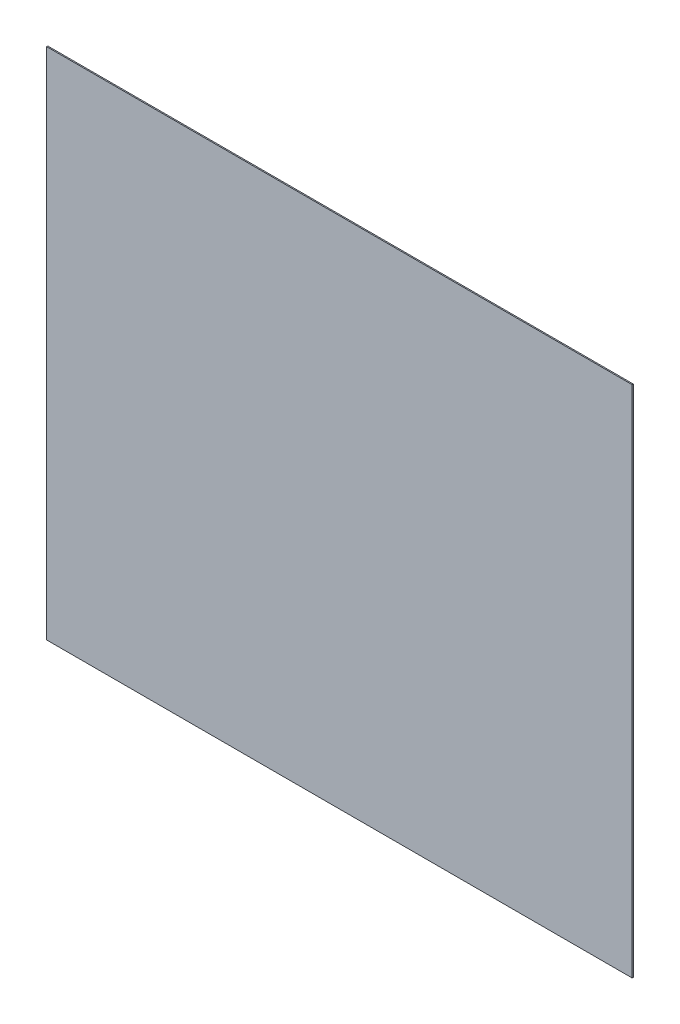
ISO-10303-21;
HEADER;
FILE_DESCRIPTION(('STEP AP214'),'2;1');
FILE_NAME('part.step','',(''),(''),'','','');
FILE_SCHEMA(('AUTOMOTIVE_DESIGN { 1 0 10303 214 1 1 1 1 }'));
ENDSEC;
DATA;
#1=APPLICATION_CONTEXT('core data for automotive mechanical design processes');
#2=APPLICATION_PROTOCOL_DEFINITION('international standard','automotive_design',2000,#1);
#3=PRODUCT_CONTEXT('',#1,'mechanical');
#4=PRODUCT('Part','Part','',(#3));
#5=PRODUCT_RELATED_PRODUCT_CATEGORY('part','',(#4));
#6=PRODUCT_DEFINITION_FORMATION('','',#4);
#7=PRODUCT_DEFINITION_CONTEXT('part definition',#1,'design');
#8=PRODUCT_DEFINITION('design','',#6,#7);
#9=PRODUCT_DEFINITION_SHAPE('','',#8);
#10=(LENGTH_UNIT() NAMED_UNIT(*) SI_UNIT(.MILLI.,.METRE.));
#11=(NAMED_UNIT(*) PLANE_ANGLE_UNIT() SI_UNIT($,.RADIAN.));
#12=(NAMED_UNIT(*) SI_UNIT($,.STERADIAN.) SOLID_ANGLE_UNIT());
#13=UNCERTAINTY_MEASURE_WITH_UNIT(LENGTH_MEASURE(1.E-05),#10,'distance_accuracy_value','');
#14=(GEOMETRIC_REPRESENTATION_CONTEXT(3) GLOBAL_UNCERTAINTY_ASSIGNED_CONTEXT((#13)) GLOBAL_UNIT_ASSIGNED_CONTEXT((#10,
#11,#12)) REPRESENTATION_CONTEXT('',''));
#15=CARTESIAN_POINT('',(0.,0.,0.));
#16=DIRECTION('',(0.,0.,1.));
#17=DIRECTION('',(1.,0.,0.));
#18=AXIS2_PLACEMENT_3D('',#15,#16,#17);
#19=CARTESIAN_POINT('',(0.,0.,2.9));
#20=DIRECTION('',(1.,0.,0.));
#21=DIRECTION('',(0.,1.,0.));
#22=AXIS2_PLACEMENT_3D('',#19,#20,#21);
#23=PLANE('',#22);
#24=DIRECTION('',(0.,-1.,0.));
#25=VECTOR('',#24,1.);
#26=CARTESIAN_POINT('',(0.,0.,0.));
#27=LINE('',#26,#25);
#28=CARTESIAN_POINT('',(0.,0.,0.));
#29=VERTEX_POINT('',#28);
#30=CARTESIAN_POINT('',(1.59204083889156E-13,-1300.,0.));
#31=VERTEX_POINT('',#30);
#32=EDGE_CURVE('E98',#29,#31,#27,.T.);
#33=ORIENTED_EDGE('',*,*,#32,.T.);
#34=DIRECTION('',(0.,0.,-1.));
#35=VECTOR('',#34,1.);
#36=CARTESIAN_POINT('',(1.59204083889156E-13,-1300.,2.9));
#37=LINE('',#36,#35);
#38=CARTESIAN_POINT('',(1.59204083889156E-13,-1300.,2.9));
#39=VERTEX_POINT('',#38);
#40=EDGE_CURVE('E11',#39,#31,#37,.T.);
#41=ORIENTED_EDGE('',*,*,#40,.F.);
#42=DIRECTION('',(0.,-1.,0.));
#43=VECTOR('',#42,1.);
#44=CARTESIAN_POINT('',(0.,0.,2.9));
#45=LINE('',#44,#43);
#46=CARTESIAN_POINT('',(0.,0.,2.9));
#47=VERTEX_POINT('',#46);
#48=EDGE_CURVE('E86',#47,#39,#45,.T.);
#49=ORIENTED_EDGE('',*,*,#48,.F.);
#50=DIRECTION('',(0.,0.,-1.));
#51=VECTOR('',#50,1.);
#52=CARTESIAN_POINT('',(0.,0.,2.9));
#53=LINE('',#52,#51);
#54=EDGE_CURVE('E94',#47,#29,#53,.T.);
#55=ORIENTED_EDGE('',*,*,#54,.T.);
#56=EDGE_LOOP('',(#33,#41,#49,#55));
#57=FACE_BOUND('',#56,.T.);
#58=ADVANCED_FACE('F35',(#57),#23,.F.);
#59=CARTESIAN_POINT('',(1.59204083889156E-13,-1300.,2.9));
#60=DIRECTION('',(0.,1.,0.));
#61=DIRECTION('',(0.,0.,1.));
#62=AXIS2_PLACEMENT_3D('',#59,#60,#61);
#63=PLANE('',#62);
#64=DIRECTION('',(1.,0.,0.));
#65=VECTOR('',#64,1.);
#66=CARTESIAN_POINT('',(1.59204083889156E-13,-1300.,0.));
#67=LINE('',#66,#65);
#68=CARTESIAN_POINT('',(1481.2,-1300.,0.));
#69=VERTEX_POINT('',#68);
#70=EDGE_CURVE('E90',#31,#69,#67,.T.);
#71=ORIENTED_EDGE('',*,*,#70,.T.);
#72=DIRECTION('',(0.,0.,-1.));
#73=VECTOR('',#72,1.);
#74=CARTESIAN_POINT('',(1481.2,-1300.,2.9));
#75=LINE('',#74,#73);
#76=CARTESIAN_POINT('',(1481.2,-1300.,2.9));
#77=VERTEX_POINT('',#76);
#78=EDGE_CURVE('E43',#77,#69,#75,.T.);
#79=ORIENTED_EDGE('',*,*,#78,.F.);
#80=DIRECTION('',(1.,0.,0.));
#81=VECTOR('',#80,1.);
#82=CARTESIAN_POINT('',(1.59204083889156E-13,-1300.,2.9));
#83=LINE('',#82,#81);
#84=EDGE_CURVE('E81',#39,#77,#83,.T.);
#85=ORIENTED_EDGE('',*,*,#84,.F.);
#86=ORIENTED_EDGE('',*,*,#40,.T.);
#87=EDGE_LOOP('',(#71,#79,#85,#86));
#88=FACE_BOUND('',#87,.T.);
#89=ADVANCED_FACE('F89',(#88),#63,.F.);
#90=CARTESIAN_POINT('',(1481.2,0.,2.9));
#91=DIRECTION('',(-1.,0.,0.));
#92=DIRECTION('',(0.,-1.,0.));
#93=AXIS2_PLACEMENT_3D('',#90,#91,#92);
#94=PLANE('',#93);
#95=DIRECTION('',(0.,1.,0.));
#96=VECTOR('',#95,1.);
#97=CARTESIAN_POINT('',(1481.2,0.,0.));
#98=LINE('',#97,#96);
#99=CARTESIAN_POINT('',(1481.2,0.,0.));
#100=VERTEX_POINT('',#99);
#101=EDGE_CURVE('E68',#69,#100,#98,.T.);
#102=ORIENTED_EDGE('',*,*,#101,.T.);
#103=DIRECTION('',(0.,0.,-1.));
#104=VECTOR('',#103,1.);
#105=CARTESIAN_POINT('',(1481.2,0.,2.9));
#106=LINE('',#105,#104);
#107=CARTESIAN_POINT('',(1481.2,0.,2.9));
#108=VERTEX_POINT('',#107);
#109=EDGE_CURVE('E91',#108,#100,#106,.T.);
#110=ORIENTED_EDGE('',*,*,#109,.F.);
#111=DIRECTION('',(0.,1.,0.));
#112=VECTOR('',#111,1.);
#113=CARTESIAN_POINT('',(1481.2,0.,2.9));
#114=LINE('',#113,#112);
#115=EDGE_CURVE('E84',#77,#108,#114,.T.);
#116=ORIENTED_EDGE('',*,*,#115,.F.);
#117=ORIENTED_EDGE('',*,*,#78,.T.);
#118=EDGE_LOOP('',(#102,#110,#116,#117));
#119=FACE_BOUND('',#118,.T.);
#120=ADVANCED_FACE('F92',(#119),#94,.F.);
#121=CARTESIAN_POINT('',(0.,0.,2.9));
#122=DIRECTION('',(0.,-1.,0.));
#123=DIRECTION('',(0.,0.,-1.));
#124=AXIS2_PLACEMENT_3D('',#121,#122,#123);
#125=PLANE('',#124);
#126=DIRECTION('',(-1.,0.,0.));
#127=VECTOR('',#126,1.);
#128=CARTESIAN_POINT('',(0.,0.,0.));
#129=LINE('',#128,#127);
#130=EDGE_CURVE('E74',#100,#29,#129,.T.);
#131=ORIENTED_EDGE('',*,*,#130,.T.);
#132=ORIENTED_EDGE('',*,*,#54,.F.);
#133=DIRECTION('',(-1.,0.,0.));
#134=VECTOR('',#133,1.);
#135=CARTESIAN_POINT('',(0.,0.,2.9));
#136=LINE('',#135,#134);
#137=EDGE_CURVE('E51',#108,#47,#136,.T.);
#138=ORIENTED_EDGE('',*,*,#137,.F.);
#139=ORIENTED_EDGE('',*,*,#109,.T.);
#140=EDGE_LOOP('',(#131,#132,#138,#139));
#141=FACE_BOUND('',#140,.T.);
#142=ADVANCED_FACE('F105',(#141),#125,.F.);
#143=CARTESIAN_POINT('',(0.,0.,2.9));
#144=DIRECTION('',(0.,0.,1.));
#145=DIRECTION('',(1.,0.,0.));
#146=AXIS2_PLACEMENT_3D('',#143,#144,#145);
#147=PLANE('',#146);
#148=ORIENTED_EDGE('',*,*,#48,.T.);
#149=ORIENTED_EDGE('',*,*,#84,.T.);
#150=ORIENTED_EDGE('',*,*,#115,.T.);
#151=ORIENTED_EDGE('',*,*,#137,.T.);
#152=EDGE_LOOP('',(#148,#149,#150,#151));
#153=FACE_BOUND('',#152,.T.);
#154=ADVANCED_FACE('F82',(#153),#147,.T.);
#155=CARTESIAN_POINT('',(0.,0.,0.));
#156=DIRECTION('',(0.,0.,1.));
#157=DIRECTION('',(1.,0.,0.));
#158=AXIS2_PLACEMENT_3D('',#155,#156,#157);
#159=PLANE('',#158);
#160=ORIENTED_EDGE('',*,*,#32,.F.);
#161=ORIENTED_EDGE('',*,*,#130,.F.);
#162=ORIENTED_EDGE('',*,*,#101,.F.);
#163=ORIENTED_EDGE('',*,*,#70,.F.);
#164=EDGE_LOOP('',(#160,#161,#162,#163));
#165=FACE_BOUND('',#164,.T.);
#166=ADVANCED_FACE('F108',(#165),#159,.F.);
#167=CLOSED_SHELL('',(#58,#89,#120,#142,#154,#166));
#168=MANIFOLD_SOLID_BREP('B2',#167);
#169=ADVANCED_BREP_SHAPE_REPRESENTATION('',(#18,#168),#14);
#170=SHAPE_DEFINITION_REPRESENTATION(#9,#169);
ENDSEC;
END-ISO-10303-21;
